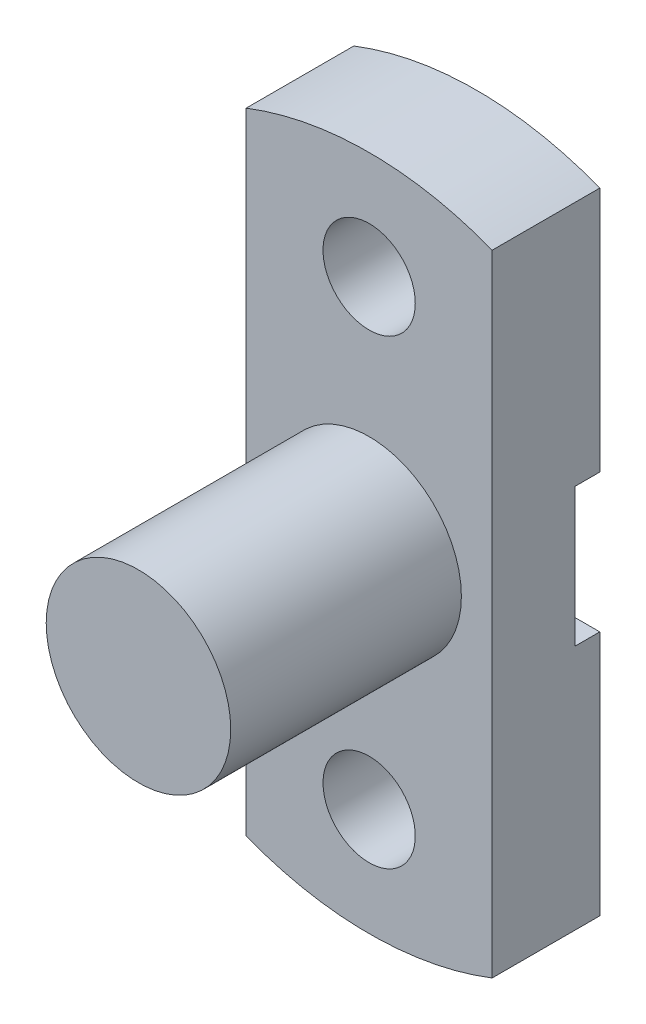
ISO-10303-21;
HEADER;
FILE_DESCRIPTION(('STEP AP214'),'2;1');
FILE_NAME('part.step','',(''),(''),'','','');
FILE_SCHEMA(('AUTOMOTIVE_DESIGN { 1 0 10303 214 1 1 1 1 }'));
ENDSEC;
DATA;
#1=APPLICATION_CONTEXT('core data for automotive mechanical design processes');
#2=APPLICATION_PROTOCOL_DEFINITION('international standard','automotive_design',2000,#1);
#3=PRODUCT_CONTEXT('',#1,'mechanical');
#4=PRODUCT('Part','Part','',(#3));
#5=PRODUCT_RELATED_PRODUCT_CATEGORY('part','',(#4));
#6=PRODUCT_DEFINITION_FORMATION('','',#4);
#7=PRODUCT_DEFINITION_CONTEXT('part definition',#1,'design');
#8=PRODUCT_DEFINITION('design','',#6,#7);
#9=PRODUCT_DEFINITION_SHAPE('','',#8);
#10=(LENGTH_UNIT() NAMED_UNIT(*) SI_UNIT(.MILLI.,.METRE.));
#11=(NAMED_UNIT(*) PLANE_ANGLE_UNIT() SI_UNIT($,.RADIAN.));
#12=(NAMED_UNIT(*) SI_UNIT($,.STERADIAN.) SOLID_ANGLE_UNIT());
#13=UNCERTAINTY_MEASURE_WITH_UNIT(LENGTH_MEASURE(1.E-05),#10,'distance_accuracy_value','');
#14=(GEOMETRIC_REPRESENTATION_CONTEXT(3) GLOBAL_UNCERTAINTY_ASSIGNED_CONTEXT((#13)) GLOBAL_UNIT_ASSIGNED_CONTEXT((#10,
#11,#12)) REPRESENTATION_CONTEXT('',''));
#15=CARTESIAN_POINT('',(0.,0.,0.));
#16=DIRECTION('',(0.,0.,1.));
#17=DIRECTION('',(1.,0.,0.));
#18=AXIS2_PLACEMENT_3D('',#15,#16,#17);
#19=CARTESIAN_POINT('',(0.,0.,0.));
#20=DIRECTION('',(0.,0.,1.));
#21=DIRECTION('',(1.,0.,0.));
#22=AXIS2_PLACEMENT_3D('',#19,#20,#21);
#23=PLANE('',#22);
#24=CARTESIAN_POINT('',(0.,75.,0.));
#25=DIRECTION('',(0.,0.,1.));
#26=DIRECTION('',(1.,0.,0.));
#27=AXIS2_PLACEMENT_3D('',#24,#25,#26);
#28=CIRCLE('',#27,15.);
#29=CARTESIAN_POINT('',(15.,75.,0.));
#30=VERTEX_POINT('',#29);
#31=EDGE_CURVE('E159',#30,#30,#28,.T.);
#32=ORIENTED_EDGE('',*,*,#31,.T.);
#33=EDGE_LOOP('',(#32));
#34=FACE_BOUND('',#33,.T.);
#35=DIRECTION('',(0.,1.,0.));
#36=VECTOR('',#35,1.);
#37=CARTESIAN_POINT('',(40.,102.469507659596,0.));
#38=LINE('',#37,#36);
#39=CARTESIAN_POINT('',(40.,22.5,0.));
#40=VERTEX_POINT('',#39);
#41=CARTESIAN_POINT('',(40.,102.469507659596,0.));
#42=VERTEX_POINT('',#41);
#43=EDGE_CURVE('E82',#40,#42,#38,.T.);
#44=ORIENTED_EDGE('',*,*,#43,.F.);
#45=DIRECTION('',(-1.,0.,0.));
#46=VECTOR('',#45,1.);
#47=CARTESIAN_POINT('',(40.,22.5,0.));
#48=LINE('',#47,#46);
#49=CARTESIAN_POINT('',(-40.,22.5,0.));
#50=VERTEX_POINT('',#49);
#51=EDGE_CURVE('E174',#40,#50,#48,.T.);
#52=ORIENTED_EDGE('',*,*,#51,.T.);
#53=DIRECTION('',(0.,-1.,0.));
#54=VECTOR('',#53,1.);
#55=CARTESIAN_POINT('',(-40.,102.469507659596,0.));
#56=LINE('',#55,#54);
#57=CARTESIAN_POINT('',(-40.,102.469507659596,0.));
#58=VERTEX_POINT('',#57);
#59=EDGE_CURVE('E148',#58,#50,#56,.T.);
#60=ORIENTED_EDGE('',*,*,#59,.F.);
#61=CARTESIAN_POINT('',(0.,0.,0.));
#62=DIRECTION('',(0.,0.,1.));
#63=DIRECTION('',(1.,0.,0.));
#64=AXIS2_PLACEMENT_3D('',#61,#62,#63);
#65=CIRCLE('',#64,110.);
#66=EDGE_CURVE('E151',#42,#58,#65,.T.);
#67=ORIENTED_EDGE('',*,*,#66,.F.);
#68=EDGE_LOOP('',(#44,#52,#60,#67));
#69=FACE_BOUND('',#68,.T.);
#70=ADVANCED_FACE('F37',(#34,#69),#23,.F.);
#71=CARTESIAN_POINT('',(0.,0.,35.));
#72=DIRECTION('',(0.,0.,1.));
#73=DIRECTION('',(1.,0.,0.));
#74=AXIS2_PLACEMENT_3D('',#71,#72,#73);
#75=PLANE('',#74);
#76=CARTESIAN_POINT('',(0.,0.,35.));
#77=DIRECTION('',(0.,0.,1.));
#78=DIRECTION('',(1.,0.,0.));
#79=AXIS2_PLACEMENT_3D('',#76,#77,#78);
#80=CIRCLE('',#79,30.);
#81=CARTESIAN_POINT('',(30.,0.,35.));
#82=VERTEX_POINT('',#81);
#83=EDGE_CURVE('E171',#82,#82,#80,.T.);
#84=ORIENTED_EDGE('',*,*,#83,.F.);
#85=EDGE_LOOP('',(#84));
#86=FACE_BOUND('',#85,.T.);
#87=CARTESIAN_POINT('',(0.,75.,35.));
#88=DIRECTION('',(0.,0.,1.));
#89=DIRECTION('',(1.,0.,0.));
#90=AXIS2_PLACEMENT_3D('',#87,#88,#89);
#91=CIRCLE('',#90,15.);
#92=CARTESIAN_POINT('',(15.,75.,35.));
#93=VERTEX_POINT('',#92);
#94=EDGE_CURVE('E155',#93,#93,#91,.T.);
#95=ORIENTED_EDGE('',*,*,#94,.F.);
#96=EDGE_LOOP('',(#95));
#97=FACE_BOUND('',#96,.T.);
#98=CARTESIAN_POINT('',(0.,0.,35.));
#99=DIRECTION('',(0.,0.,1.));
#100=DIRECTION('',(1.,0.,0.));
#101=AXIS2_PLACEMENT_3D('',#98,#99,#100);
#102=CIRCLE('',#101,110.);
#103=CARTESIAN_POINT('',(40.,102.469507659596,35.));
#104=VERTEX_POINT('',#103);
#105=CARTESIAN_POINT('',(-40.,102.469507659596,35.));
#106=VERTEX_POINT('',#105);
#107=EDGE_CURVE('E134',#104,#106,#102,.T.);
#108=ORIENTED_EDGE('',*,*,#107,.T.);
#109=DIRECTION('',(0.,-1.,0.));
#110=VECTOR('',#109,1.);
#111=CARTESIAN_POINT('',(-40.,102.469507659596,35.));
#112=LINE('',#111,#110);
#113=CARTESIAN_POINT('',(-40.,-102.469507659596,35.));
#114=VERTEX_POINT('',#113);
#115=EDGE_CURVE('E89',#106,#114,#112,.T.);
#116=ORIENTED_EDGE('',*,*,#115,.T.);
#117=CARTESIAN_POINT('',(0.,0.,35.));
#118=DIRECTION('',(0.,0.,1.));
#119=DIRECTION('',(1.,0.,0.));
#120=AXIS2_PLACEMENT_3D('',#117,#118,#119);
#121=CIRCLE('',#120,110.);
#122=CARTESIAN_POINT('',(40.,-102.469507659596,35.));
#123=VERTEX_POINT('',#122);
#124=EDGE_CURVE('E147',#114,#123,#121,.T.);
#125=ORIENTED_EDGE('',*,*,#124,.T.);
#126=DIRECTION('',(0.,1.,0.));
#127=VECTOR('',#126,1.);
#128=CARTESIAN_POINT('',(40.,102.469507659596,35.));
#129=LINE('',#128,#127);
#130=EDGE_CURVE('E61',#123,#104,#129,.T.);
#131=ORIENTED_EDGE('',*,*,#130,.T.);
#132=EDGE_LOOP('',(#108,#116,#125,#131));
#133=FACE_BOUND('',#132,.T.);
#134=CARTESIAN_POINT('',(0.,-75.,35.));
#135=DIRECTION('',(0.,0.,1.));
#136=DIRECTION('',(-1.,0.,0.));
#137=AXIS2_PLACEMENT_3D('',#134,#135,#136);
#138=CIRCLE('',#137,15.);
#139=CARTESIAN_POINT('',(-15.,-75.,35.));
#140=VERTEX_POINT('',#139);
#141=EDGE_CURVE('E162',#140,#140,#138,.T.);
#142=ORIENTED_EDGE('',*,*,#141,.F.);
#143=EDGE_LOOP('',(#142));
#144=FACE_BOUND('',#143,.T.);
#145=ADVANCED_FACE('F196',(#86,#97,#133,#144),#75,.T.);
#146=CARTESIAN_POINT('',(-40.,-22.5,0.));
#147=VERTEX_POINT('',#146);
#148=CARTESIAN_POINT('',(-40.,-102.469507659596,0.));
#149=VERTEX_POINT('',#148);
#150=EDGE_CURVE('E127',#147,#149,#56,.T.);
#151=ORIENTED_EDGE('',*,*,#150,.F.);
#152=DIRECTION('',(-1.,0.,0.));
#153=VECTOR('',#152,1.);
#154=CARTESIAN_POINT('',(40.,-22.5,0.));
#155=LINE('',#154,#153);
#156=CARTESIAN_POINT('',(40.,-22.5,0.));
#157=VERTEX_POINT('',#156);
#158=EDGE_CURVE('E114',#157,#147,#155,.T.);
#159=ORIENTED_EDGE('',*,*,#158,.F.);
#160=CARTESIAN_POINT('',(40.,-102.469507659596,0.));
#161=VERTEX_POINT('',#160);
#162=EDGE_CURVE('E126',#161,#157,#38,.T.);
#163=ORIENTED_EDGE('',*,*,#162,.F.);
#164=CARTESIAN_POINT('',(0.,0.,0.));
#165=DIRECTION('',(0.,0.,1.));
#166=DIRECTION('',(1.,0.,0.));
#167=AXIS2_PLACEMENT_3D('',#164,#165,#166);
#168=CIRCLE('',#167,110.);
#169=EDGE_CURVE('E137',#149,#161,#168,.T.);
#170=ORIENTED_EDGE('',*,*,#169,.F.);
#171=EDGE_LOOP('',(#151,#159,#163,#170));
#172=FACE_BOUND('',#171,.T.);
#173=CARTESIAN_POINT('',(0.,-75.,0.));
#174=DIRECTION('',(0.,0.,1.));
#175=DIRECTION('',(-1.,0.,0.));
#176=AXIS2_PLACEMENT_3D('',#173,#174,#175);
#177=CIRCLE('',#176,15.);
#178=CARTESIAN_POINT('',(-15.,-75.,0.));
#179=VERTEX_POINT('',#178);
#180=EDGE_CURVE('E165',#179,#179,#177,.T.);
#181=ORIENTED_EDGE('',*,*,#180,.T.);
#182=EDGE_LOOP('',(#181));
#183=FACE_BOUND('',#182,.T.);
#184=ADVANCED_FACE('F123',(#172,#183),#23,.F.);
#185=CARTESIAN_POINT('',(0.,0.,35.));
#186=DIRECTION('',(0.,0.,-1.));
#187=DIRECTION('',(-1.,0.,0.));
#188=AXIS2_PLACEMENT_3D('',#185,#186,#187);
#189=CYLINDRICAL_SURFACE('',#188,110.);
#190=ORIENTED_EDGE('',*,*,#66,.T.);
#191=DIRECTION('',(0.,0.,-1.));
#192=VECTOR('',#191,1.);
#193=CARTESIAN_POINT('',(-40.,102.469507659596,35.));
#194=LINE('',#193,#192);
#195=EDGE_CURVE('E11',#106,#58,#194,.T.);
#196=ORIENTED_EDGE('',*,*,#195,.F.);
#197=ORIENTED_EDGE('',*,*,#107,.F.);
#198=DIRECTION('',(0.,0.,-1.));
#199=VECTOR('',#198,1.);
#200=CARTESIAN_POINT('',(40.,102.469507659596,35.));
#201=LINE('',#200,#199);
#202=EDGE_CURVE('E141',#104,#42,#201,.T.);
#203=ORIENTED_EDGE('',*,*,#202,.T.);
#204=EDGE_LOOP('',(#190,#196,#197,#203));
#205=FACE_BOUND('',#204,.T.);
#206=ADVANCED_FACE('F39',(#205),#189,.T.);
#207=CARTESIAN_POINT('',(-40.,102.469507659596,35.));
#208=DIRECTION('',(1.,0.,0.));
#209=DIRECTION('',(0.,1.,0.));
#210=AXIS2_PLACEMENT_3D('',#207,#208,#209);
#211=PLANE('',#210);
#212=ORIENTED_EDGE('',*,*,#59,.T.);
#213=DIRECTION('',(0.,0.,-1.));
#214=VECTOR('',#213,1.);
#215=CARTESIAN_POINT('',(-40.,22.5,0.));
#216=LINE('',#215,#214);
#217=CARTESIAN_POINT('',(-40.,22.5,8.));
#218=VERTEX_POINT('',#217);
#219=EDGE_CURVE('E118',#218,#50,#216,.T.);
#220=ORIENTED_EDGE('',*,*,#219,.F.);
#221=DIRECTION('',(0.,1.,0.));
#222=VECTOR('',#221,1.);
#223=CARTESIAN_POINT('',(-40.,22.5,8.));
#224=LINE('',#223,#222);
#225=CARTESIAN_POINT('',(-40.,-22.5,8.00000000000001));
#226=VERTEX_POINT('',#225);
#227=EDGE_CURVE('E183',#226,#218,#224,.T.);
#228=ORIENTED_EDGE('',*,*,#227,.F.);
#229=DIRECTION('',(0.,0.,1.));
#230=VECTOR('',#229,1.);
#231=CARTESIAN_POINT('',(-40.,-22.5,8.00000000000001));
#232=LINE('',#231,#230);
#233=EDGE_CURVE('E186',#147,#226,#232,.T.);
#234=ORIENTED_EDGE('',*,*,#233,.F.);
#235=ORIENTED_EDGE('',*,*,#150,.T.);
#236=DIRECTION('',(0.,0.,-1.));
#237=VECTOR('',#236,1.);
#238=CARTESIAN_POINT('',(-40.,-102.469507659596,35.));
#239=LINE('',#238,#237);
#240=EDGE_CURVE('E45',#114,#149,#239,.T.);
#241=ORIENTED_EDGE('',*,*,#240,.F.);
#242=ORIENTED_EDGE('',*,*,#115,.F.);
#243=ORIENTED_EDGE('',*,*,#195,.T.);
#244=EDGE_LOOP('',(#212,#220,#228,#234,#235,#241,#242,#243));
#245=FACE_BOUND('',#244,.T.);
#246=ADVANCED_FACE('F217',(#245),#211,.F.);
#247=CARTESIAN_POINT('',(0.,0.,35.));
#248=DIRECTION('',(0.,0.,-1.));
#249=DIRECTION('',(-1.,0.,0.));
#250=AXIS2_PLACEMENT_3D('',#247,#248,#249);
#251=CYLINDRICAL_SURFACE('',#250,110.);
#252=ORIENTED_EDGE('',*,*,#169,.T.);
#253=DIRECTION('',(0.,0.,-1.));
#254=VECTOR('',#253,1.);
#255=CARTESIAN_POINT('',(40.,-102.469507659596,35.));
#256=LINE('',#255,#254);
#257=EDGE_CURVE('E133',#123,#161,#256,.T.);
#258=ORIENTED_EDGE('',*,*,#257,.F.);
#259=ORIENTED_EDGE('',*,*,#124,.F.);
#260=ORIENTED_EDGE('',*,*,#240,.T.);
#261=EDGE_LOOP('',(#252,#258,#259,#260));
#262=FACE_BOUND('',#261,.T.);
#263=ADVANCED_FACE('F146',(#262),#251,.T.);
#264=CARTESIAN_POINT('',(40.,102.469507659596,35.));
#265=DIRECTION('',(-1.,0.,0.));
#266=DIRECTION('',(0.,-1.,0.));
#267=AXIS2_PLACEMENT_3D('',#264,#265,#266);
#268=PLANE('',#267);
#269=DIRECTION('',(0.,1.,0.));
#270=VECTOR('',#269,1.);
#271=CARTESIAN_POINT('',(40.,22.5,8.));
#272=LINE('',#271,#270);
#273=CARTESIAN_POINT('',(40.,-22.5,8.));
#274=VERTEX_POINT('',#273);
#275=CARTESIAN_POINT('',(40.,22.5,8.));
#276=VERTEX_POINT('',#275);
#277=EDGE_CURVE('E52',#274,#276,#272,.T.);
#278=ORIENTED_EDGE('',*,*,#277,.T.);
#279=DIRECTION('',(0.,0.,-1.));
#280=VECTOR('',#279,1.);
#281=CARTESIAN_POINT('',(40.,22.5,0.));
#282=LINE('',#281,#280);
#283=EDGE_CURVE('E128',#276,#40,#282,.T.);
#284=ORIENTED_EDGE('',*,*,#283,.T.);
#285=ORIENTED_EDGE('',*,*,#43,.T.);
#286=ORIENTED_EDGE('',*,*,#202,.F.);
#287=ORIENTED_EDGE('',*,*,#130,.F.);
#288=ORIENTED_EDGE('',*,*,#257,.T.);
#289=ORIENTED_EDGE('',*,*,#162,.T.);
#290=DIRECTION('',(0.,0.,1.));
#291=VECTOR('',#290,1.);
#292=CARTESIAN_POINT('',(40.,-22.5,8.00000000000001));
#293=LINE('',#292,#291);
#294=EDGE_CURVE('E110',#157,#274,#293,.T.);
#295=ORIENTED_EDGE('',*,*,#294,.T.);
#296=EDGE_LOOP('',(#278,#284,#285,#286,#287,#288,#289,#295));
#297=FACE_BOUND('',#296,.T.);
#298=ADVANCED_FACE('F131',(#297),#268,.F.);
#299=CARTESIAN_POINT('',(0.,75.,35.));
#300=DIRECTION('',(0.,0.,-1.));
#301=DIRECTION('',(-1.,0.,0.));
#302=AXIS2_PLACEMENT_3D('',#299,#300,#301);
#303=CYLINDRICAL_SURFACE('',#302,15.);
#304=ORIENTED_EDGE('',*,*,#94,.T.);
#305=EDGE_LOOP('',(#304));
#306=FACE_BOUND('',#305,.T.);
#307=ORIENTED_EDGE('',*,*,#31,.F.);
#308=EDGE_LOOP('',(#307));
#309=FACE_BOUND('',#308,.T.);
#310=ADVANCED_FACE('F207',(#306,#309),#303,.F.);
#311=CARTESIAN_POINT('',(0.,-75.,35.));
#312=DIRECTION('',(0.,0.,-1.));
#313=DIRECTION('',(-1.,0.,0.));
#314=AXIS2_PLACEMENT_3D('',#311,#312,#313);
#315=CYLINDRICAL_SURFACE('',#314,15.);
#316=ORIENTED_EDGE('',*,*,#141,.T.);
#317=EDGE_LOOP('',(#316));
#318=FACE_BOUND('',#317,.T.);
#319=ORIENTED_EDGE('',*,*,#180,.F.);
#320=EDGE_LOOP('',(#319));
#321=FACE_BOUND('',#320,.T.);
#322=ADVANCED_FACE('F203',(#318,#321),#315,.F.);
#323=CARTESIAN_POINT('',(0.,0.,110.));
#324=DIRECTION('',(0.,0.,-1.));
#325=DIRECTION('',(-1.,0.,0.));
#326=AXIS2_PLACEMENT_3D('',#323,#324,#325);
#327=CYLINDRICAL_SURFACE('',#326,30.);
#328=CARTESIAN_POINT('',(0.,0.,110.));
#329=DIRECTION('',(0.,0.,1.));
#330=DIRECTION('',(1.,0.,0.));
#331=AXIS2_PLACEMENT_3D('',#328,#329,#330);
#332=CIRCLE('',#331,30.);
#333=CARTESIAN_POINT('',(30.,0.,110.));
#334=VERTEX_POINT('',#333);
#335=EDGE_CURVE('E168',#334,#334,#332,.T.);
#336=ORIENTED_EDGE('',*,*,#335,.F.);
#337=EDGE_LOOP('',(#336));
#338=FACE_BOUND('',#337,.T.);
#339=ORIENTED_EDGE('',*,*,#83,.T.);
#340=EDGE_LOOP('',(#339));
#341=FACE_BOUND('',#340,.T.);
#342=ADVANCED_FACE('F206',(#338,#341),#327,.T.);
#343=CARTESIAN_POINT('',(0.,0.,110.));
#344=DIRECTION('',(0.,0.,1.));
#345=DIRECTION('',(1.,0.,0.));
#346=AXIS2_PLACEMENT_3D('',#343,#344,#345);
#347=PLANE('',#346);
#348=ORIENTED_EDGE('',*,*,#335,.T.);
#349=EDGE_LOOP('',(#348));
#350=FACE_BOUND('',#349,.T.);
#351=ADVANCED_FACE('F235',(#350),#347,.T.);
#352=CARTESIAN_POINT('',(40.,22.5,0.));
#353=DIRECTION('',(0.,1.,0.));
#354=DIRECTION('',(0.,0.,1.));
#355=AXIS2_PLACEMENT_3D('',#352,#353,#354);
#356=PLANE('',#355);
#357=ORIENTED_EDGE('',*,*,#219,.T.);
#358=ORIENTED_EDGE('',*,*,#51,.F.);
#359=ORIENTED_EDGE('',*,*,#283,.F.);
#360=DIRECTION('',(-1.,0.,0.));
#361=VECTOR('',#360,1.);
#362=CARTESIAN_POINT('',(40.,22.5,8.));
#363=LINE('',#362,#361);
#364=EDGE_CURVE('E178',#276,#218,#363,.T.);
#365=ORIENTED_EDGE('',*,*,#364,.T.);
#366=EDGE_LOOP('',(#357,#358,#359,#365));
#367=FACE_BOUND('',#366,.T.);
#368=ADVANCED_FACE('F239',(#367),#356,.F.);
#369=CARTESIAN_POINT('',(40.,22.5,8.));
#370=DIRECTION('',(0.,0.,1.));
#371=DIRECTION('',(0.,-1.,0.));
#372=AXIS2_PLACEMENT_3D('',#369,#370,#371);
#373=PLANE('',#372);
#374=ORIENTED_EDGE('',*,*,#227,.T.);
#375=ORIENTED_EDGE('',*,*,#364,.F.);
#376=ORIENTED_EDGE('',*,*,#277,.F.);
#377=DIRECTION('',(-1.,0.,0.));
#378=VECTOR('',#377,1.);
#379=CARTESIAN_POINT('',(40.,-22.5,8.00000000000001));
#380=LINE('',#379,#378);
#381=EDGE_CURVE('E116',#274,#226,#380,.T.);
#382=ORIENTED_EDGE('',*,*,#381,.T.);
#383=EDGE_LOOP('',(#374,#375,#376,#382));
#384=FACE_BOUND('',#383,.T.);
#385=ADVANCED_FACE('F243',(#384),#373,.F.);
#386=CARTESIAN_POINT('',(40.,-22.5,8.00000000000001));
#387=DIRECTION('',(0.,-1.,0.));
#388=DIRECTION('',(0.,0.,-1.));
#389=AXIS2_PLACEMENT_3D('',#386,#387,#388);
#390=PLANE('',#389);
#391=ORIENTED_EDGE('',*,*,#233,.T.);
#392=ORIENTED_EDGE('',*,*,#381,.F.);
#393=ORIENTED_EDGE('',*,*,#294,.F.);
#394=ORIENTED_EDGE('',*,*,#158,.T.);
#395=EDGE_LOOP('',(#391,#392,#393,#394));
#396=FACE_BOUND('',#395,.T.);
#397=ADVANCED_FACE('F113',(#396),#390,.F.);
#398=CLOSED_SHELL('',(#70,#145,#184,#206,#246,#263,#298,#310,#322,#342,#351,#368,#385,#397));
#399=MANIFOLD_SOLID_BREP('B2',#398);
#400=ADVANCED_BREP_SHAPE_REPRESENTATION('',(#18,#399),#14);
#401=SHAPE_DEFINITION_REPRESENTATION(#9,#400);
ENDSEC;
END-ISO-10303-21;
